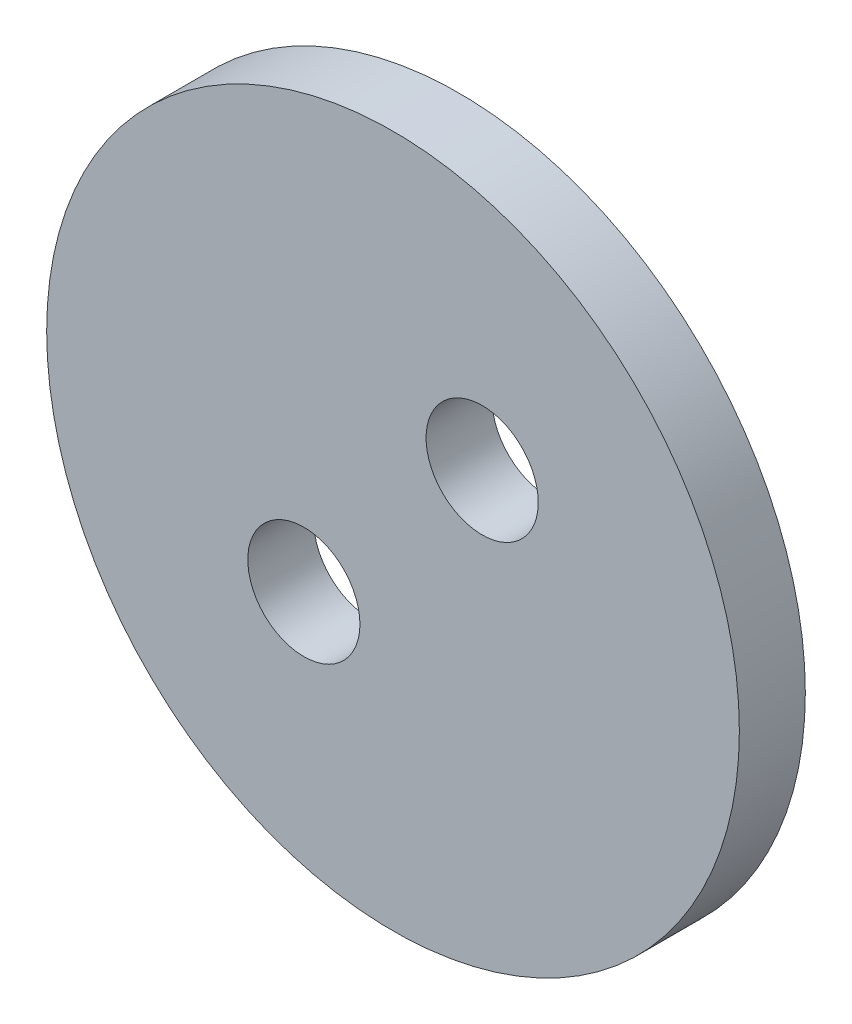
ISO-10303-21;
HEADER;
FILE_DESCRIPTION(('STEP AP214'),'2;1');
FILE_NAME('part.step','',(''),(''),'','','');
FILE_SCHEMA(('AUTOMOTIVE_DESIGN { 1 0 10303 214 1 1 1 1 }'));
ENDSEC;
DATA;
#1=APPLICATION_CONTEXT('core data for automotive mechanical design processes');
#2=APPLICATION_PROTOCOL_DEFINITION('international standard','automotive_design',2000,#1);
#3=PRODUCT_CONTEXT('',#1,'mechanical');
#4=PRODUCT('Part','Part','',(#3));
#5=PRODUCT_RELATED_PRODUCT_CATEGORY('part','',(#4));
#6=PRODUCT_DEFINITION_FORMATION('','',#4);
#7=PRODUCT_DEFINITION_CONTEXT('part definition',#1,'design');
#8=PRODUCT_DEFINITION('design','',#6,#7);
#9=PRODUCT_DEFINITION_SHAPE('','',#8);
#10=(LENGTH_UNIT() NAMED_UNIT(*) SI_UNIT(.MILLI.,.METRE.));
#11=(NAMED_UNIT(*) PLANE_ANGLE_UNIT() SI_UNIT($,.RADIAN.));
#12=(NAMED_UNIT(*) SI_UNIT($,.STERADIAN.) SOLID_ANGLE_UNIT());
#13=UNCERTAINTY_MEASURE_WITH_UNIT(LENGTH_MEASURE(1.E-05),#10,'distance_accuracy_value','');
#14=(GEOMETRIC_REPRESENTATION_CONTEXT(3) GLOBAL_UNCERTAINTY_ASSIGNED_CONTEXT((#13)) GLOBAL_UNIT_ASSIGNED_CONTEXT((#10,
#11,#12)) REPRESENTATION_CONTEXT('',''));
#15=CARTESIAN_POINT('',(0.,0.,0.));
#16=DIRECTION('',(0.,0.,1.));
#17=DIRECTION('',(1.,0.,0.));
#18=AXIS2_PLACEMENT_3D('',#15,#16,#17);
#19=CARTESIAN_POINT('',(0.,0.,2.));
#20=DIRECTION('',(0.,0.,-1.));
#21=DIRECTION('',(-1.,0.,0.));
#22=AXIS2_PLACEMENT_3D('',#19,#20,#21);
#23=CYLINDRICAL_SURFACE('',#22,10.5);
#24=CARTESIAN_POINT('',(0.,0.,2.));
#25=DIRECTION('',(0.,0.,1.));
#26=DIRECTION('',(1.,0.,0.));
#27=AXIS2_PLACEMENT_3D('',#24,#25,#26);
#28=CIRCLE('',#27,10.5);
#29=CARTESIAN_POINT('',(10.5,0.,2.));
#30=VERTEX_POINT('',#29);
#31=EDGE_CURVE('E10',#30,#30,#28,.T.);
#32=ORIENTED_EDGE('',*,*,#31,.F.);
#33=EDGE_LOOP('',(#32));
#34=FACE_BOUND('',#33,.T.);
#35=CARTESIAN_POINT('',(0.,0.,0.));
#36=DIRECTION('',(0.,0.,1.));
#37=DIRECTION('',(1.,0.,0.));
#38=AXIS2_PLACEMENT_3D('',#35,#36,#37);
#39=CIRCLE('',#38,10.5);
#40=CARTESIAN_POINT('',(10.5,0.,0.));
#41=VERTEX_POINT('',#40);
#42=EDGE_CURVE('E36',#41,#41,#39,.T.);
#43=ORIENTED_EDGE('',*,*,#42,.T.);
#44=EDGE_LOOP('',(#43));
#45=FACE_BOUND('',#44,.T.);
#46=ADVANCED_FACE('F33',(#34,#45),#23,.T.);
#47=CARTESIAN_POINT('',(0.,0.,2.));
#48=DIRECTION('',(0.,0.,1.));
#49=DIRECTION('',(1.,0.,0.));
#50=AXIS2_PLACEMENT_3D('',#47,#48,#49);
#51=PLANE('',#50);
#52=CARTESIAN_POINT('',(2.70236571897508,2.9491048677367,2.));
#53=DIRECTION('',(0.,0.,1.));
#54=DIRECTION('',(1.,0.,0.));
#55=AXIS2_PLACEMENT_3D('',#52,#53,#54);
#56=CIRCLE('',#55,1.69999999999999);
#57=CARTESIAN_POINT('',(4.40236571897507,2.9491048677367,2.));
#58=VERTEX_POINT('',#57);
#59=EDGE_CURVE('E53',#58,#58,#56,.T.);
#60=ORIENTED_EDGE('',*,*,#59,.F.);
#61=EDGE_LOOP('',(#60));
#62=FACE_BOUND('',#61,.T.);
#63=CARTESIAN_POINT('',(-2.70236571897508,-2.9491048677367,2.));
#64=DIRECTION('',(0.,0.,1.));
#65=DIRECTION('',(1.,0.,0.));
#66=AXIS2_PLACEMENT_3D('',#63,#64,#65);
#67=CIRCLE('',#66,1.69999999999999);
#68=CARTESIAN_POINT('',(-1.00236571897509,-2.9491048677367,2.));
#69=VERTEX_POINT('',#68);
#70=EDGE_CURVE('E47',#69,#69,#67,.T.);
#71=ORIENTED_EDGE('',*,*,#70,.F.);
#72=EDGE_LOOP('',(#71));
#73=FACE_BOUND('',#72,.T.);
#74=ORIENTED_EDGE('',*,*,#31,.T.);
#75=EDGE_LOOP('',(#74));
#76=FACE_BOUND('',#75,.T.);
#77=ADVANCED_FACE('F59',(#62,#73,#76),#51,.T.);
#78=CARTESIAN_POINT('',(0.,0.,0.));
#79=DIRECTION('',(0.,0.,1.));
#80=DIRECTION('',(1.,0.,0.));
#81=AXIS2_PLACEMENT_3D('',#78,#79,#80);
#82=PLANE('',#81);
#83=CARTESIAN_POINT('',(2.70236571897508,2.9491048677367,0.));
#84=DIRECTION('',(0.,0.,1.));
#85=DIRECTION('',(1.,0.,0.));
#86=AXIS2_PLACEMENT_3D('',#83,#84,#85);
#87=CIRCLE('',#86,1.7);
#88=CARTESIAN_POINT('',(4.40236571897508,2.9491048677367,0.));
#89=VERTEX_POINT('',#88);
#90=EDGE_CURVE('E50',#89,#89,#87,.T.);
#91=ORIENTED_EDGE('',*,*,#90,.T.);
#92=EDGE_LOOP('',(#91));
#93=FACE_BOUND('',#92,.T.);
#94=CARTESIAN_POINT('',(-2.70236571897508,-2.9491048677367,0.));
#95=DIRECTION('',(0.,0.,1.));
#96=DIRECTION('',(1.,0.,0.));
#97=AXIS2_PLACEMENT_3D('',#94,#95,#96);
#98=CIRCLE('',#97,1.7);
#99=CARTESIAN_POINT('',(-1.00236571897508,-2.9491048677367,0.));
#100=VERTEX_POINT('',#99);
#101=EDGE_CURVE('E43',#100,#100,#98,.T.);
#102=ORIENTED_EDGE('',*,*,#101,.T.);
#103=EDGE_LOOP('',(#102));
#104=FACE_BOUND('',#103,.T.);
#105=ORIENTED_EDGE('',*,*,#42,.F.);
#106=EDGE_LOOP('',(#105));
#107=FACE_BOUND('',#106,.T.);
#108=ADVANCED_FACE('F62',(#93,#104,#107),#82,.F.);
#109=CARTESIAN_POINT('',(-2.70236571897508,-2.9491048677367,2.));
#110=DIRECTION('',(0.,0.,1.));
#111=DIRECTION('',(1.,0.,0.));
#112=AXIS2_PLACEMENT_3D('',#109,#110,#111);
#113=CYLINDRICAL_SURFACE('',#112,1.69999999999999);
#114=ORIENTED_EDGE('',*,*,#101,.F.);
#115=EDGE_LOOP('',(#114));
#116=FACE_BOUND('',#115,.T.);
#117=ORIENTED_EDGE('',*,*,#70,.T.);
#118=EDGE_LOOP('',(#117));
#119=FACE_BOUND('',#118,.T.);
#120=ADVANCED_FACE('F66',(#116,#119),#113,.F.);
#121=CARTESIAN_POINT('',(2.70236571897508,2.9491048677367,2.));
#122=DIRECTION('',(0.,0.,1.));
#123=DIRECTION('',(1.,0.,0.));
#124=AXIS2_PLACEMENT_3D('',#121,#122,#123);
#125=CYLINDRICAL_SURFACE('',#124,1.69999999999999);
#126=ORIENTED_EDGE('',*,*,#90,.F.);
#127=EDGE_LOOP('',(#126));
#128=FACE_BOUND('',#127,.T.);
#129=ORIENTED_EDGE('',*,*,#59,.T.);
#130=EDGE_LOOP('',(#129));
#131=FACE_BOUND('',#130,.T.);
#132=ADVANCED_FACE('F57',(#128,#131),#125,.F.);
#133=CLOSED_SHELL('',(#46,#77,#108,#120,#132));
#134=MANIFOLD_SOLID_BREP('B2',#133);
#135=ADVANCED_BREP_SHAPE_REPRESENTATION('',(#18,#134),#14);
#136=SHAPE_DEFINITION_REPRESENTATION(#9,#135);
ENDSEC;
END-ISO-10303-21;
